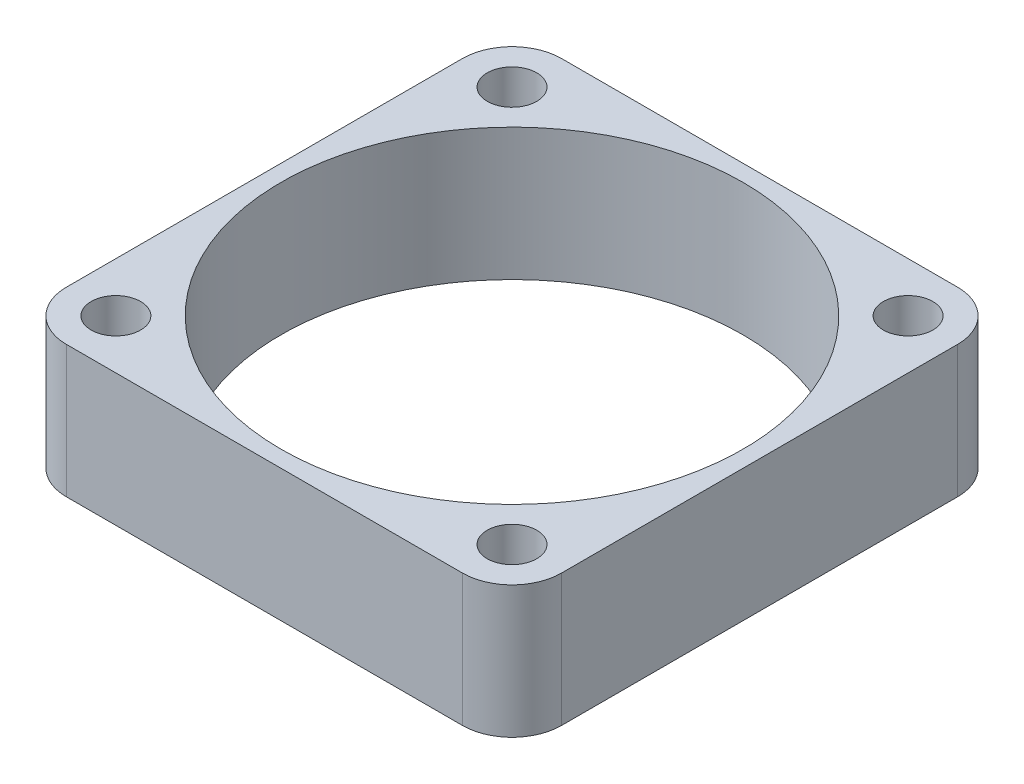
ISO-10303-21;
HEADER;
FILE_DESCRIPTION(('STEP AP214'),'2;1');
FILE_NAME('part.step','',(''),(''),'','','');
FILE_SCHEMA(('AUTOMOTIVE_DESIGN { 1 0 10303 214 1 1 1 1 }'));
ENDSEC;
DATA;
#1=APPLICATION_CONTEXT('core data for automotive mechanical design processes');
#2=APPLICATION_PROTOCOL_DEFINITION('international standard','automotive_design',2000,#1);
#3=PRODUCT_CONTEXT('',#1,'mechanical');
#4=PRODUCT('Part','Part','',(#3));
#5=PRODUCT_RELATED_PRODUCT_CATEGORY('part','',(#4));
#6=PRODUCT_DEFINITION_FORMATION('','',#4);
#7=PRODUCT_DEFINITION_CONTEXT('part definition',#1,'design');
#8=PRODUCT_DEFINITION('design','',#6,#7);
#9=PRODUCT_DEFINITION_SHAPE('','',#8);
#10=(LENGTH_UNIT() NAMED_UNIT(*) SI_UNIT(.MILLI.,.METRE.));
#11=(NAMED_UNIT(*) PLANE_ANGLE_UNIT() SI_UNIT($,.RADIAN.));
#12=(NAMED_UNIT(*) SI_UNIT($,.STERADIAN.) SOLID_ANGLE_UNIT());
#13=UNCERTAINTY_MEASURE_WITH_UNIT(LENGTH_MEASURE(1.E-05),#10,'distance_accuracy_value','');
#14=(GEOMETRIC_REPRESENTATION_CONTEXT(3) GLOBAL_UNCERTAINTY_ASSIGNED_CONTEXT((#13)) GLOBAL_UNIT_ASSIGNED_CONTEXT((#10,
#11,#12)) REPRESENTATION_CONTEXT('',''));
#15=CARTESIAN_POINT('',(0.,0.,0.));
#16=DIRECTION('',(0.,0.,1.));
#17=DIRECTION('',(1.,0.,0.));
#18=AXIS2_PLACEMENT_3D('',#15,#16,#17);
#19=CARTESIAN_POINT('',(0.,8.,0.));
#20=DIRECTION('',(0.,-1.,0.));
#21=DIRECTION('',(0.,0.,-1.));
#22=AXIS2_PLACEMENT_3D('',#19,#20,#21);
#23=PLANE('',#22);
#24=DIRECTION('',(-1.,0.,0.));
#25=VECTOR('',#24,1.);
#26=CARTESIAN_POINT('',(-15.,8.,-15.));
#27=LINE('',#26,#25);
#28=CARTESIAN_POINT('',(12.,8.,-15.));
#29=VERTEX_POINT('',#28);
#30=CARTESIAN_POINT('',(-12.,8.,-15.));
#31=VERTEX_POINT('',#30);
#32=EDGE_CURVE('E172',#29,#31,#27,.T.);
#33=ORIENTED_EDGE('',*,*,#32,.T.);
#34=CARTESIAN_POINT('',(-12.,8.,-12.));
#35=DIRECTION('',(0.,-1.,0.));
#36=DIRECTION('',(0.,0.,-1.));
#37=AXIS2_PLACEMENT_3D('',#34,#35,#36);
#38=CIRCLE('',#37,3.);
#39=CARTESIAN_POINT('',(-15.,8.,-12.));
#40=VERTEX_POINT('',#39);
#41=EDGE_CURVE('E150',#31,#40,#38,.F.);
#42=ORIENTED_EDGE('',*,*,#41,.T.);
#43=DIRECTION('',(0.,0.,1.));
#44=VECTOR('',#43,1.);
#45=CARTESIAN_POINT('',(-15.,8.,15.));
#46=LINE('',#45,#44);
#47=CARTESIAN_POINT('',(-15.,8.,12.));
#48=VERTEX_POINT('',#47);
#49=EDGE_CURVE('E120',#40,#48,#46,.T.);
#50=ORIENTED_EDGE('',*,*,#49,.T.);
#51=CARTESIAN_POINT('',(-12.,8.,12.));
#52=DIRECTION('',(0.,-1.,0.));
#53=DIRECTION('',(0.,0.,-1.));
#54=AXIS2_PLACEMENT_3D('',#51,#52,#53);
#55=CIRCLE('',#54,3.);
#56=CARTESIAN_POINT('',(-12.,8.,15.));
#57=VERTEX_POINT('',#56);
#58=EDGE_CURVE('E56',#48,#57,#55,.F.);
#59=ORIENTED_EDGE('',*,*,#58,.T.);
#60=DIRECTION('',(1.,0.,0.));
#61=VECTOR('',#60,1.);
#62=CARTESIAN_POINT('',(-15.,8.,15.));
#63=LINE('',#62,#61);
#64=CARTESIAN_POINT('',(12.,8.,15.));
#65=VERTEX_POINT('',#64);
#66=EDGE_CURVE('E136',#57,#65,#63,.T.);
#67=ORIENTED_EDGE('',*,*,#66,.T.);
#68=CARTESIAN_POINT('',(12.,8.,12.));
#69=DIRECTION('',(0.,-1.,0.));
#70=DIRECTION('',(0.,0.,-1.));
#71=AXIS2_PLACEMENT_3D('',#68,#69,#70);
#72=CIRCLE('',#71,3.);
#73=CARTESIAN_POINT('',(15.,8.,12.));
#74=VERTEX_POINT('',#73);
#75=EDGE_CURVE('E146',#65,#74,#72,.F.);
#76=ORIENTED_EDGE('',*,*,#75,.T.);
#77=DIRECTION('',(0.,0.,-1.));
#78=VECTOR('',#77,1.);
#79=CARTESIAN_POINT('',(15.,8.,15.));
#80=LINE('',#79,#78);
#81=CARTESIAN_POINT('',(15.,8.,-12.));
#82=VERTEX_POINT('',#81);
#83=EDGE_CURVE('E130',#74,#82,#80,.T.);
#84=ORIENTED_EDGE('',*,*,#83,.T.);
#85=CARTESIAN_POINT('',(12.,8.,-12.));
#86=DIRECTION('',(0.,-1.,0.));
#87=DIRECTION('',(0.,0.,-1.));
#88=AXIS2_PLACEMENT_3D('',#85,#86,#87);
#89=CIRCLE('',#88,3.);
#90=EDGE_CURVE('E148',#82,#29,#89,.F.);
#91=ORIENTED_EDGE('',*,*,#90,.T.);
#92=EDGE_LOOP('',(#33,#42,#50,#59,#67,#76,#84,#91));
#93=FACE_BOUND('',#92,.T.);
#94=CARTESIAN_POINT('',(12.,8.,-12.));
#95=DIRECTION('',(0.,1.,0.));
#96=DIRECTION('',(0.,0.,1.));
#97=AXIS2_PLACEMENT_3D('',#94,#95,#96);
#98=CIRCLE('',#97,1.5);
#99=CARTESIAN_POINT('',(12.,8.,-10.5));
#100=VERTEX_POINT('',#99);
#101=EDGE_CURVE('E181',#100,#100,#98,.T.);
#102=ORIENTED_EDGE('',*,*,#101,.F.);
#103=EDGE_LOOP('',(#102));
#104=FACE_BOUND('',#103,.T.);
#105=CARTESIAN_POINT('',(-12.,8.,-12.));
#106=DIRECTION('',(0.,1.,0.));
#107=DIRECTION('',(0.,0.,1.));
#108=AXIS2_PLACEMENT_3D('',#105,#106,#107);
#109=CIRCLE('',#108,1.5);
#110=CARTESIAN_POINT('',(-12.,8.,-10.5));
#111=VERTEX_POINT('',#110);
#112=EDGE_CURVE('E186',#111,#111,#109,.T.);
#113=ORIENTED_EDGE('',*,*,#112,.F.);
#114=EDGE_LOOP('',(#113));
#115=FACE_BOUND('',#114,.T.);
#116=CARTESIAN_POINT('',(0.,8.,0.));
#117=DIRECTION('',(0.,1.,0.));
#118=DIRECTION('',(0.,0.,1.));
#119=AXIS2_PLACEMENT_3D('',#116,#117,#118);
#120=CIRCLE('',#119,14.);
#121=CARTESIAN_POINT('',(0.,8.,14.));
#122=VERTEX_POINT('',#121);
#123=EDGE_CURVE('E191',#122,#122,#120,.T.);
#124=ORIENTED_EDGE('',*,*,#123,.F.);
#125=EDGE_LOOP('',(#124));
#126=FACE_BOUND('',#125,.T.);
#127=CARTESIAN_POINT('',(-12.,8.,12.));
#128=DIRECTION('',(0.,1.,0.));
#129=DIRECTION('',(0.,0.,1.));
#130=AXIS2_PLACEMENT_3D('',#127,#128,#129);
#131=CIRCLE('',#130,1.5);
#132=CARTESIAN_POINT('',(-12.,8.,13.5));
#133=VERTEX_POINT('',#132);
#134=EDGE_CURVE('E197',#133,#133,#131,.T.);
#135=ORIENTED_EDGE('',*,*,#134,.F.);
#136=EDGE_LOOP('',(#135));
#137=FACE_BOUND('',#136,.T.);
#138=CARTESIAN_POINT('',(12.,8.,12.));
#139=DIRECTION('',(0.,1.,0.));
#140=DIRECTION('',(0.,0.,1.));
#141=AXIS2_PLACEMENT_3D('',#138,#139,#140);
#142=CIRCLE('',#141,1.5);
#143=CARTESIAN_POINT('',(12.,8.,13.5));
#144=VERTEX_POINT('',#143);
#145=EDGE_CURVE('E203',#144,#144,#142,.T.);
#146=ORIENTED_EDGE('',*,*,#145,.F.);
#147=EDGE_LOOP('',(#146));
#148=FACE_BOUND('',#147,.T.);
#149=ADVANCED_FACE('F36',(#93,#104,#115,#126,#137,#148),#23,.F.);
#150=CARTESIAN_POINT('',(0.,0.,0.));
#151=DIRECTION('',(0.,-1.,0.));
#152=DIRECTION('',(0.,0.,-1.));
#153=AXIS2_PLACEMENT_3D('',#150,#151,#152);
#154=PLANE('',#153);
#155=CARTESIAN_POINT('',(-12.,0.,12.));
#156=DIRECTION('',(0.,1.,0.));
#157=DIRECTION('',(0.,0.,1.));
#158=AXIS2_PLACEMENT_3D('',#155,#156,#157);
#159=CIRCLE('',#158,1.5);
#160=CARTESIAN_POINT('',(-12.,0.,13.5));
#161=VERTEX_POINT('',#160);
#162=EDGE_CURVE('E200',#161,#161,#159,.T.);
#163=ORIENTED_EDGE('',*,*,#162,.T.);
#164=EDGE_LOOP('',(#163));
#165=FACE_BOUND('',#164,.T.);
#166=CARTESIAN_POINT('',(-12.,0.,-12.));
#167=DIRECTION('',(0.,1.,0.));
#168=DIRECTION('',(0.,0.,1.));
#169=AXIS2_PLACEMENT_3D('',#166,#167,#168);
#170=CIRCLE('',#169,1.5);
#171=CARTESIAN_POINT('',(-12.,0.,-10.5));
#172=VERTEX_POINT('',#171);
#173=EDGE_CURVE('E188',#172,#172,#170,.T.);
#174=ORIENTED_EDGE('',*,*,#173,.T.);
#175=EDGE_LOOP('',(#174));
#176=FACE_BOUND('',#175,.T.);
#177=DIRECTION('',(0.,0.,1.));
#178=VECTOR('',#177,1.);
#179=CARTESIAN_POINT('',(-15.,0.,15.));
#180=LINE('',#179,#178);
#181=CARTESIAN_POINT('',(-15.,0.,-12.));
#182=VERTEX_POINT('',#181);
#183=CARTESIAN_POINT('',(-15.,0.,12.));
#184=VERTEX_POINT('',#183);
#185=EDGE_CURVE('E118',#182,#184,#180,.T.);
#186=ORIENTED_EDGE('',*,*,#185,.F.);
#187=CARTESIAN_POINT('',(-12.,0.,-12.));
#188=DIRECTION('',(0.,-1.,0.));
#189=DIRECTION('',(0.,0.,-1.));
#190=AXIS2_PLACEMENT_3D('',#187,#188,#189);
#191=CIRCLE('',#190,3.);
#192=CARTESIAN_POINT('',(-12.,0.,-15.));
#193=VERTEX_POINT('',#192);
#194=EDGE_CURVE('E101',#182,#193,#191,.T.);
#195=ORIENTED_EDGE('',*,*,#194,.T.);
#196=DIRECTION('',(-1.,0.,0.));
#197=VECTOR('',#196,1.);
#198=CARTESIAN_POINT('',(-15.,0.,-15.));
#199=LINE('',#198,#197);
#200=CARTESIAN_POINT('',(12.,0.,-15.));
#201=VERTEX_POINT('',#200);
#202=EDGE_CURVE('E128',#201,#193,#199,.T.);
#203=ORIENTED_EDGE('',*,*,#202,.F.);
#204=CARTESIAN_POINT('',(12.,0.,-12.));
#205=DIRECTION('',(0.,-1.,0.));
#206=DIRECTION('',(0.,0.,-1.));
#207=AXIS2_PLACEMENT_3D('',#204,#205,#206);
#208=CIRCLE('',#207,3.);
#209=CARTESIAN_POINT('',(15.,0.,-12.));
#210=VERTEX_POINT('',#209);
#211=EDGE_CURVE('E112',#201,#210,#208,.T.);
#212=ORIENTED_EDGE('',*,*,#211,.T.);
#213=DIRECTION('',(0.,0.,-1.));
#214=VECTOR('',#213,1.);
#215=CARTESIAN_POINT('',(15.,0.,15.));
#216=LINE('',#215,#214);
#217=CARTESIAN_POINT('',(15.,0.,12.));
#218=VERTEX_POINT('',#217);
#219=EDGE_CURVE('E132',#218,#210,#216,.T.);
#220=ORIENTED_EDGE('',*,*,#219,.F.);
#221=CARTESIAN_POINT('',(12.,0.,12.));
#222=DIRECTION('',(0.,-1.,0.));
#223=DIRECTION('',(0.,0.,-1.));
#224=AXIS2_PLACEMENT_3D('',#221,#222,#223);
#225=CIRCLE('',#224,3.);
#226=CARTESIAN_POINT('',(12.,0.,15.));
#227=VERTEX_POINT('',#226);
#228=EDGE_CURVE('E139',#218,#227,#225,.T.);
#229=ORIENTED_EDGE('',*,*,#228,.T.);
#230=DIRECTION('',(1.,0.,0.));
#231=VECTOR('',#230,1.);
#232=CARTESIAN_POINT('',(-15.,0.,15.));
#233=LINE('',#232,#231);
#234=CARTESIAN_POINT('',(-12.,0.,15.));
#235=VERTEX_POINT('',#234);
#236=EDGE_CURVE('E127',#235,#227,#233,.T.);
#237=ORIENTED_EDGE('',*,*,#236,.F.);
#238=CARTESIAN_POINT('',(-12.,0.,12.));
#239=DIRECTION('',(0.,-1.,0.));
#240=DIRECTION('',(0.,0.,-1.));
#241=AXIS2_PLACEMENT_3D('',#238,#239,#240);
#242=CIRCLE('',#241,3.);
#243=EDGE_CURVE('E121',#235,#184,#242,.T.);
#244=ORIENTED_EDGE('',*,*,#243,.T.);
#245=EDGE_LOOP('',(#186,#195,#203,#212,#220,#229,#237,#244));
#246=FACE_BOUND('',#245,.T.);
#247=CARTESIAN_POINT('',(12.,0.,-12.));
#248=DIRECTION('',(0.,1.,0.));
#249=DIRECTION('',(0.,0.,1.));
#250=AXIS2_PLACEMENT_3D('',#247,#248,#249);
#251=CIRCLE('',#250,1.5);
#252=CARTESIAN_POINT('',(12.,0.,-10.5));
#253=VERTEX_POINT('',#252);
#254=EDGE_CURVE('E177',#253,#253,#251,.T.);
#255=ORIENTED_EDGE('',*,*,#254,.T.);
#256=EDGE_LOOP('',(#255));
#257=FACE_BOUND('',#256,.T.);
#258=CARTESIAN_POINT('',(0.,0.,0.));
#259=DIRECTION('',(0.,1.,0.));
#260=DIRECTION('',(0.,0.,1.));
#261=AXIS2_PLACEMENT_3D('',#258,#259,#260);
#262=CIRCLE('',#261,14.);
#263=CARTESIAN_POINT('',(0.,0.,14.));
#264=VERTEX_POINT('',#263);
#265=EDGE_CURVE('E194',#264,#264,#262,.T.);
#266=ORIENTED_EDGE('',*,*,#265,.T.);
#267=EDGE_LOOP('',(#266));
#268=FACE_BOUND('',#267,.T.);
#269=CARTESIAN_POINT('',(12.,0.,12.));
#270=DIRECTION('',(0.,1.,0.));
#271=DIRECTION('',(0.,0.,1.));
#272=AXIS2_PLACEMENT_3D('',#269,#270,#271);
#273=CIRCLE('',#272,1.5);
#274=CARTESIAN_POINT('',(12.,0.,13.5));
#275=VERTEX_POINT('',#274);
#276=EDGE_CURVE('E206',#275,#275,#273,.T.);
#277=ORIENTED_EDGE('',*,*,#276,.T.);
#278=EDGE_LOOP('',(#277));
#279=FACE_BOUND('',#278,.T.);
#280=ADVANCED_FACE('F124',(#165,#176,#246,#257,#268,#279),#154,.T.);
#281=CARTESIAN_POINT('',(15.,8.,15.));
#282=DIRECTION('',(-1.,0.,0.));
#283=DIRECTION('',(0.,0.,1.));
#284=AXIS2_PLACEMENT_3D('',#281,#282,#283);
#285=PLANE('',#284);
#286=ORIENTED_EDGE('',*,*,#219,.T.);
#287=DIRECTION('',(0.,-1.,0.));
#288=VECTOR('',#287,1.);
#289=CARTESIAN_POINT('',(15.,8.,-12.));
#290=LINE('',#289,#288);
#291=EDGE_CURVE('E155',#210,#82,#290,.F.);
#292=ORIENTED_EDGE('',*,*,#291,.T.);
#293=ORIENTED_EDGE('',*,*,#83,.F.);
#294=DIRECTION('',(0.,-1.,0.));
#295=VECTOR('',#294,1.);
#296=CARTESIAN_POINT('',(15.,8.,12.));
#297=LINE('',#296,#295);
#298=EDGE_CURVE('E152',#74,#218,#297,.T.);
#299=ORIENTED_EDGE('',*,*,#298,.T.);
#300=EDGE_LOOP('',(#286,#292,#293,#299));
#301=FACE_BOUND('',#300,.T.);
#302=ADVANCED_FACE('F168',(#301),#285,.F.);
#303=CARTESIAN_POINT('',(-15.,8.,-15.));
#304=DIRECTION('',(0.,0.,1.));
#305=DIRECTION('',(1.,0.,0.));
#306=AXIS2_PLACEMENT_3D('',#303,#304,#305);
#307=PLANE('',#306);
#308=ORIENTED_EDGE('',*,*,#202,.T.);
#309=DIRECTION('',(0.,-1.,0.));
#310=VECTOR('',#309,1.);
#311=CARTESIAN_POINT('',(-12.,8.,-15.));
#312=LINE('',#311,#310);
#313=EDGE_CURVE('E106',#193,#31,#312,.F.);
#314=ORIENTED_EDGE('',*,*,#313,.T.);
#315=ORIENTED_EDGE('',*,*,#32,.F.);
#316=DIRECTION('',(0.,-1.,0.));
#317=VECTOR('',#316,1.);
#318=CARTESIAN_POINT('',(12.,8.,-15.));
#319=LINE('',#318,#317);
#320=EDGE_CURVE('E111',#29,#201,#319,.T.);
#321=ORIENTED_EDGE('',*,*,#320,.T.);
#322=EDGE_LOOP('',(#308,#314,#315,#321));
#323=FACE_BOUND('',#322,.T.);
#324=ADVANCED_FACE('F231',(#323),#307,.F.);
#325=CARTESIAN_POINT('',(-15.,8.,15.));
#326=DIRECTION('',(1.,0.,0.));
#327=DIRECTION('',(0.,0.,-1.));
#328=AXIS2_PLACEMENT_3D('',#325,#326,#327);
#329=PLANE('',#328);
#330=ORIENTED_EDGE('',*,*,#49,.F.);
#331=DIRECTION('',(0.,-1.,0.));
#332=VECTOR('',#331,1.);
#333=CARTESIAN_POINT('',(-15.,8.,-12.));
#334=LINE('',#333,#332);
#335=EDGE_CURVE('E105',#40,#182,#334,.T.);
#336=ORIENTED_EDGE('',*,*,#335,.T.);
#337=ORIENTED_EDGE('',*,*,#185,.T.);
#338=DIRECTION('',(0.,-1.,0.));
#339=VECTOR('',#338,1.);
#340=CARTESIAN_POINT('',(-15.,8.,12.));
#341=LINE('',#340,#339);
#342=EDGE_CURVE('E122',#184,#48,#341,.F.);
#343=ORIENTED_EDGE('',*,*,#342,.T.);
#344=EDGE_LOOP('',(#330,#336,#337,#343));
#345=FACE_BOUND('',#344,.T.);
#346=ADVANCED_FACE('F117',(#345),#329,.F.);
#347=CARTESIAN_POINT('',(-15.,8.,15.));
#348=DIRECTION('',(0.,0.,-1.));
#349=DIRECTION('',(-1.,0.,0.));
#350=AXIS2_PLACEMENT_3D('',#347,#348,#349);
#351=PLANE('',#350);
#352=ORIENTED_EDGE('',*,*,#236,.T.);
#353=DIRECTION('',(0.,-1.,0.));
#354=VECTOR('',#353,1.);
#355=CARTESIAN_POINT('',(12.,8.,15.));
#356=LINE('',#355,#354);
#357=EDGE_CURVE('E11',#227,#65,#356,.F.);
#358=ORIENTED_EDGE('',*,*,#357,.T.);
#359=ORIENTED_EDGE('',*,*,#66,.F.);
#360=DIRECTION('',(0.,-1.,0.));
#361=VECTOR('',#360,1.);
#362=CARTESIAN_POINT('',(-12.,8.,15.));
#363=LINE('',#362,#361);
#364=EDGE_CURVE('E44',#57,#235,#363,.T.);
#365=ORIENTED_EDGE('',*,*,#364,.T.);
#366=EDGE_LOOP('',(#352,#358,#359,#365));
#367=FACE_BOUND('',#366,.T.);
#368=ADVANCED_FACE('F158',(#367),#351,.F.);
#369=CARTESIAN_POINT('',(12.,8.,-12.));
#370=DIRECTION('',(0.,-1.,0.));
#371=DIRECTION('',(0.,0.,-1.));
#372=AXIS2_PLACEMENT_3D('',#369,#370,#371);
#373=CYLINDRICAL_SURFACE('',#372,1.5);
#374=ORIENTED_EDGE('',*,*,#101,.T.);
#375=EDGE_LOOP('',(#374));
#376=FACE_BOUND('',#375,.T.);
#377=ORIENTED_EDGE('',*,*,#254,.F.);
#378=EDGE_LOOP('',(#377));
#379=FACE_BOUND('',#378,.T.);
#380=ADVANCED_FACE('F224',(#376,#379),#373,.F.);
#381=CARTESIAN_POINT('',(-12.,8.,-12.));
#382=DIRECTION('',(0.,-1.,0.));
#383=DIRECTION('',(0.,0.,-1.));
#384=AXIS2_PLACEMENT_3D('',#381,#382,#383);
#385=CYLINDRICAL_SURFACE('',#384,1.5);
#386=ORIENTED_EDGE('',*,*,#112,.T.);
#387=EDGE_LOOP('',(#386));
#388=FACE_BOUND('',#387,.T.);
#389=ORIENTED_EDGE('',*,*,#173,.F.);
#390=EDGE_LOOP('',(#389));
#391=FACE_BOUND('',#390,.T.);
#392=ADVANCED_FACE('F330',(#388,#391),#385,.F.);
#393=CARTESIAN_POINT('',(0.,8.,0.));
#394=DIRECTION('',(0.,-1.,0.));
#395=DIRECTION('',(0.,0.,-1.));
#396=AXIS2_PLACEMENT_3D('',#393,#394,#395);
#397=CYLINDRICAL_SURFACE('',#396,14.);
#398=ORIENTED_EDGE('',*,*,#123,.T.);
#399=EDGE_LOOP('',(#398));
#400=FACE_BOUND('',#399,.T.);
#401=ORIENTED_EDGE('',*,*,#265,.F.);
#402=EDGE_LOOP('',(#401));
#403=FACE_BOUND('',#402,.T.);
#404=ADVANCED_FACE('F320',(#400,#403),#397,.F.);
#405=CARTESIAN_POINT('',(-12.,8.,12.));
#406=DIRECTION('',(0.,-1.,0.));
#407=DIRECTION('',(0.,0.,-1.));
#408=AXIS2_PLACEMENT_3D('',#405,#406,#407);
#409=CYLINDRICAL_SURFACE('',#408,1.5);
#410=ORIENTED_EDGE('',*,*,#134,.T.);
#411=EDGE_LOOP('',(#410));
#412=FACE_BOUND('',#411,.T.);
#413=ORIENTED_EDGE('',*,*,#162,.F.);
#414=EDGE_LOOP('',(#413));
#415=FACE_BOUND('',#414,.T.);
#416=ADVANCED_FACE('F311',(#412,#415),#409,.F.);
#417=CARTESIAN_POINT('',(12.,8.,12.));
#418=DIRECTION('',(0.,-1.,0.));
#419=DIRECTION('',(0.,0.,-1.));
#420=AXIS2_PLACEMENT_3D('',#417,#418,#419);
#421=CYLINDRICAL_SURFACE('',#420,1.5);
#422=ORIENTED_EDGE('',*,*,#145,.T.);
#423=EDGE_LOOP('',(#422));
#424=FACE_BOUND('',#423,.T.);
#425=ORIENTED_EDGE('',*,*,#276,.F.);
#426=EDGE_LOOP('',(#425));
#427=FACE_BOUND('',#426,.T.);
#428=ADVANCED_FACE('F212',(#424,#427),#421,.F.);
#429=CARTESIAN_POINT('',(-12.,8.,-12.));
#430=DIRECTION('',(0.,-1.,0.));
#431=DIRECTION('',(0.,0.,-1.));
#432=AXIS2_PLACEMENT_3D('',#429,#430,#431);
#433=CYLINDRICAL_SURFACE('',#432,3.);
#434=ORIENTED_EDGE('',*,*,#41,.F.);
#435=ORIENTED_EDGE('',*,*,#313,.F.);
#436=ORIENTED_EDGE('',*,*,#194,.F.);
#437=ORIENTED_EDGE('',*,*,#335,.F.);
#438=EDGE_LOOP('',(#434,#435,#436,#437));
#439=FACE_BOUND('',#438,.T.);
#440=ADVANCED_FACE('F104',(#439),#433,.T.);
#441=CARTESIAN_POINT('',(12.,8.,-12.));
#442=DIRECTION('',(0.,-1.,0.));
#443=DIRECTION('',(0.,0.,-1.));
#444=AXIS2_PLACEMENT_3D('',#441,#442,#443);
#445=CYLINDRICAL_SURFACE('',#444,3.);
#446=ORIENTED_EDGE('',*,*,#90,.F.);
#447=ORIENTED_EDGE('',*,*,#291,.F.);
#448=ORIENTED_EDGE('',*,*,#211,.F.);
#449=ORIENTED_EDGE('',*,*,#320,.F.);
#450=EDGE_LOOP('',(#446,#447,#448,#449));
#451=FACE_BOUND('',#450,.T.);
#452=ADVANCED_FACE('F239',(#451),#445,.T.);
#453=CARTESIAN_POINT('',(12.,8.,12.));
#454=DIRECTION('',(0.,-1.,0.));
#455=DIRECTION('',(0.,0.,-1.));
#456=AXIS2_PLACEMENT_3D('',#453,#454,#455);
#457=CYLINDRICAL_SURFACE('',#456,3.);
#458=ORIENTED_EDGE('',*,*,#75,.F.);
#459=ORIENTED_EDGE('',*,*,#357,.F.);
#460=ORIENTED_EDGE('',*,*,#228,.F.);
#461=ORIENTED_EDGE('',*,*,#298,.F.);
#462=EDGE_LOOP('',(#458,#459,#460,#461));
#463=FACE_BOUND('',#462,.T.);
#464=ADVANCED_FACE('F165',(#463),#457,.T.);
#465=CARTESIAN_POINT('',(-12.,8.,12.));
#466=DIRECTION('',(0.,-1.,0.));
#467=DIRECTION('',(0.,0.,-1.));
#468=AXIS2_PLACEMENT_3D('',#465,#466,#467);
#469=CYLINDRICAL_SURFACE('',#468,3.);
#470=ORIENTED_EDGE('',*,*,#58,.F.);
#471=ORIENTED_EDGE('',*,*,#342,.F.);
#472=ORIENTED_EDGE('',*,*,#243,.F.);
#473=ORIENTED_EDGE('',*,*,#364,.F.);
#474=EDGE_LOOP('',(#470,#471,#472,#473));
#475=FACE_BOUND('',#474,.T.);
#476=ADVANCED_FACE('F38',(#475),#469,.T.);
#477=CLOSED_SHELL('',(#149,#280,#302,#324,#346,#368,#380,#392,#404,#416,#428,#440,#452,#464,#476));
#478=MANIFOLD_SOLID_BREP('B2',#477);
#479=ADVANCED_BREP_SHAPE_REPRESENTATION('',(#18,#478),#14);
#480=SHAPE_DEFINITION_REPRESENTATION(#9,#479);
ENDSEC;
END-ISO-10303-21;
